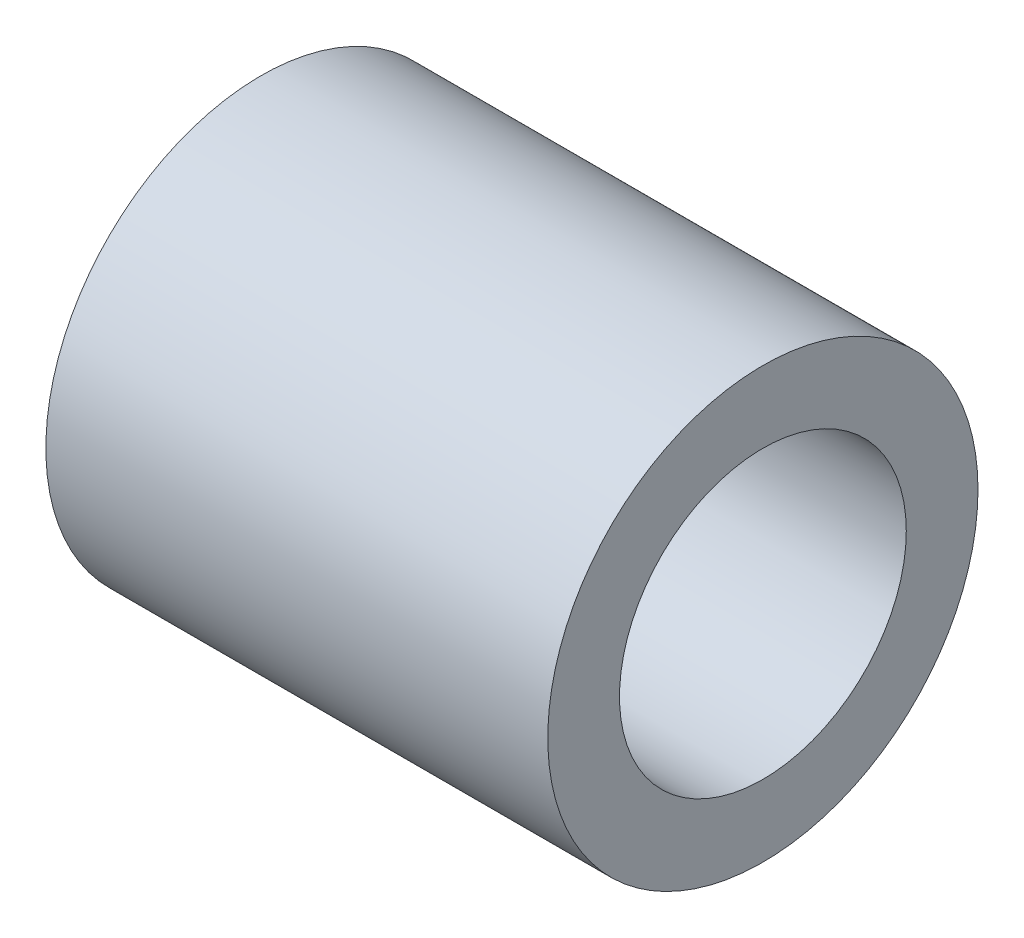
ISO-10303-21;
HEADER;
FILE_DESCRIPTION(('STEP AP214'),'2;1');
FILE_NAME('part.step','',(''),(''),'','','');
FILE_SCHEMA(('AUTOMOTIVE_DESIGN { 1 0 10303 214 1 1 1 1 }'));
ENDSEC;
DATA;
#1=APPLICATION_CONTEXT('core data for automotive mechanical design processes');
#2=APPLICATION_PROTOCOL_DEFINITION('international standard','automotive_design',2000,#1);
#3=PRODUCT_CONTEXT('',#1,'mechanical');
#4=PRODUCT('Part','Part','',(#3));
#5=PRODUCT_RELATED_PRODUCT_CATEGORY('part','',(#4));
#6=PRODUCT_DEFINITION_FORMATION('','',#4);
#7=PRODUCT_DEFINITION_CONTEXT('part definition',#1,'design');
#8=PRODUCT_DEFINITION('design','',#6,#7);
#9=PRODUCT_DEFINITION_SHAPE('','',#8);
#10=(LENGTH_UNIT() NAMED_UNIT(*) SI_UNIT(.MILLI.,.METRE.));
#11=(NAMED_UNIT(*) PLANE_ANGLE_UNIT() SI_UNIT($,.RADIAN.));
#12=(NAMED_UNIT(*) SI_UNIT($,.STERADIAN.) SOLID_ANGLE_UNIT());
#13=UNCERTAINTY_MEASURE_WITH_UNIT(LENGTH_MEASURE(1.E-05),#10,'distance_accuracy_value','');
#14=(GEOMETRIC_REPRESENTATION_CONTEXT(3) GLOBAL_UNCERTAINTY_ASSIGNED_CONTEXT((#13)) GLOBAL_UNIT_ASSIGNED_CONTEXT((#10,
#11,#12)) REPRESENTATION_CONTEXT('',''));
#15=CARTESIAN_POINT('',(0.,0.,0.));
#16=DIRECTION('',(0.,0.,1.));
#17=DIRECTION('',(1.,0.,0.));
#18=AXIS2_PLACEMENT_3D('',#15,#16,#17);
#19=CARTESIAN_POINT('',(0.875,0.,0.));
#20=DIRECTION('',(1.,0.,0.));
#21=DIRECTION('',(0.,0.,-1.));
#22=AXIS2_PLACEMENT_3D('',#19,#20,#21);
#23=PLANE('',#22);
#24=CARTESIAN_POINT('',(0.875,0.,0.));
#25=DIRECTION('',(1.,0.,0.));
#26=DIRECTION('',(0.,0.,-1.));
#27=AXIS2_PLACEMENT_3D('',#24,#25,#26);
#28=CIRCLE('',#27,0.375);
#29=CARTESIAN_POINT('',(0.875,0.,-0.375));
#30=VERTEX_POINT('',#29);
#31=EDGE_CURVE('E10',#30,#30,#28,.T.);
#32=ORIENTED_EDGE('',*,*,#31,.T.);
#33=EDGE_LOOP('',(#32));
#34=FACE_BOUND('',#33,.T.);
#35=CARTESIAN_POINT('',(0.875,0.,0.));
#36=DIRECTION('',(1.,0.,0.));
#37=DIRECTION('',(0.,0.,-1.));
#38=AXIS2_PLACEMENT_3D('',#35,#36,#37);
#39=CIRCLE('',#38,0.25);
#40=CARTESIAN_POINT('',(0.875,0.,-0.25));
#41=VERTEX_POINT('',#40);
#42=EDGE_CURVE('E42',#41,#41,#39,.T.);
#43=ORIENTED_EDGE('',*,*,#42,.F.);
#44=EDGE_LOOP('',(#43));
#45=FACE_BOUND('',#44,.T.);
#46=ADVANCED_FACE('F31',(#34,#45),#23,.T.);
#47=CARTESIAN_POINT('',(0.,0.,0.));
#48=DIRECTION('',(1.,0.,0.));
#49=DIRECTION('',(0.,0.,-1.));
#50=AXIS2_PLACEMENT_3D('',#47,#48,#49);
#51=PLANE('',#50);
#52=CARTESIAN_POINT('',(0.,0.,0.));
#53=DIRECTION('',(1.,0.,0.));
#54=DIRECTION('',(0.,0.,-1.));
#55=AXIS2_PLACEMENT_3D('',#52,#53,#54);
#56=CIRCLE('',#55,0.375);
#57=CARTESIAN_POINT('',(0.,0.,-0.375));
#58=VERTEX_POINT('',#57);
#59=EDGE_CURVE('E35',#58,#58,#56,.T.);
#60=ORIENTED_EDGE('',*,*,#59,.F.);
#61=EDGE_LOOP('',(#60));
#62=FACE_BOUND('',#61,.T.);
#63=CARTESIAN_POINT('',(0.,0.,0.));
#64=DIRECTION('',(1.,0.,0.));
#65=DIRECTION('',(0.,0.,-1.));
#66=AXIS2_PLACEMENT_3D('',#63,#64,#65);
#67=CIRCLE('',#66,0.25);
#68=CARTESIAN_POINT('',(0.,0.,-0.25));
#69=VERTEX_POINT('',#68);
#70=EDGE_CURVE('E44',#69,#69,#67,.T.);
#71=ORIENTED_EDGE('',*,*,#70,.T.);
#72=EDGE_LOOP('',(#71));
#73=FACE_BOUND('',#72,.T.);
#74=ADVANCED_FACE('F54',(#62,#73),#51,.F.);
#75=CARTESIAN_POINT('',(0.875,0.,0.));
#76=DIRECTION('',(-1.,0.,0.));
#77=DIRECTION('',(0.,0.,1.));
#78=AXIS2_PLACEMENT_3D('',#75,#76,#77);
#79=CYLINDRICAL_SURFACE('',#78,0.375);
#80=ORIENTED_EDGE('',*,*,#31,.F.);
#81=EDGE_LOOP('',(#80));
#82=FACE_BOUND('',#81,.T.);
#83=ORIENTED_EDGE('',*,*,#59,.T.);
#84=EDGE_LOOP('',(#83));
#85=FACE_BOUND('',#84,.T.);
#86=ADVANCED_FACE('F33',(#82,#85),#79,.T.);
#87=CARTESIAN_POINT('',(0.875,0.,0.));
#88=DIRECTION('',(-1.,0.,0.));
#89=DIRECTION('',(0.,0.,1.));
#90=AXIS2_PLACEMENT_3D('',#87,#88,#89);
#91=CYLINDRICAL_SURFACE('',#90,0.25);
#92=ORIENTED_EDGE('',*,*,#42,.T.);
#93=EDGE_LOOP('',(#92));
#94=FACE_BOUND('',#93,.T.);
#95=ORIENTED_EDGE('',*,*,#70,.F.);
#96=EDGE_LOOP('',(#95));
#97=FACE_BOUND('',#96,.T.);
#98=ADVANCED_FACE('F50',(#94,#97),#91,.F.);
#99=CLOSED_SHELL('',(#46,#74,#86,#98));
#100=MANIFOLD_SOLID_BREP('B2',#99);
#101=ADVANCED_BREP_SHAPE_REPRESENTATION('',(#18,#100),#14);
#102=SHAPE_DEFINITION_REPRESENTATION(#9,#101);
ENDSEC;
END-ISO-10303-21;
